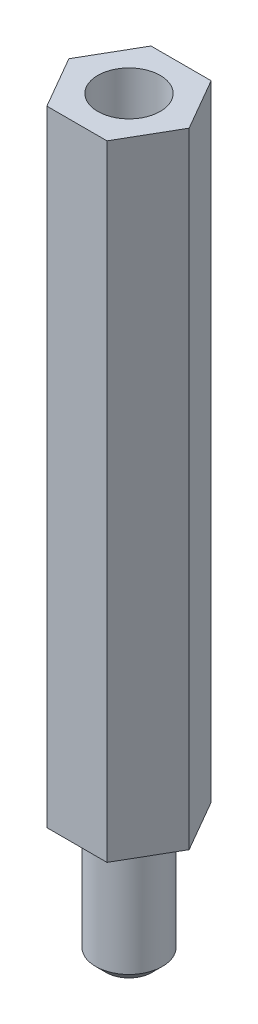
ISO-10303-21;
HEADER;
FILE_DESCRIPTION(('STEP AP214'),'2;1');
FILE_NAME('part.step','',(''),(''),'','','');
FILE_SCHEMA(('AUTOMOTIVE_DESIGN { 1 0 10303 214 1 1 1 1 }'));
ENDSEC;
DATA;
#1=APPLICATION_CONTEXT('core data for automotive mechanical design processes');
#2=APPLICATION_PROTOCOL_DEFINITION('international standard','automotive_design',2000,#1);
#3=PRODUCT_CONTEXT('',#1,'mechanical');
#4=PRODUCT('Part','Part','',(#3));
#5=PRODUCT_RELATED_PRODUCT_CATEGORY('part','',(#4));
#6=PRODUCT_DEFINITION_FORMATION('','',#4);
#7=PRODUCT_DEFINITION_CONTEXT('part definition',#1,'design');
#8=PRODUCT_DEFINITION('design','',#6,#7);
#9=PRODUCT_DEFINITION_SHAPE('','',#8);
#10=(LENGTH_UNIT() NAMED_UNIT(*) SI_UNIT(.MILLI.,.METRE.));
#11=(NAMED_UNIT(*) PLANE_ANGLE_UNIT() SI_UNIT($,.RADIAN.));
#12=(NAMED_UNIT(*) SI_UNIT($,.STERADIAN.) SOLID_ANGLE_UNIT());
#13=UNCERTAINTY_MEASURE_WITH_UNIT(LENGTH_MEASURE(1.E-05),#10,'distance_accuracy_value','');
#14=(GEOMETRIC_REPRESENTATION_CONTEXT(3) GLOBAL_UNCERTAINTY_ASSIGNED_CONTEXT((#13)) GLOBAL_UNIT_ASSIGNED_CONTEXT((#10,
#11,#12)) REPRESENTATION_CONTEXT('',''));
#15=CARTESIAN_POINT('',(0.,0.,0.));
#16=DIRECTION('',(0.,0.,1.));
#17=DIRECTION('',(1.,0.,0.));
#18=AXIS2_PLACEMENT_3D('',#15,#16,#17);
#19=CARTESIAN_POINT('',(0.,30.,0.));
#20=DIRECTION('',(0.,-1.,0.));
#21=DIRECTION('',(0.,0.,-1.));
#22=AXIS2_PLACEMENT_3D('',#19,#20,#21);
#23=CYLINDRICAL_SURFACE('',#22,1.5);
#24=CARTESIAN_POINT('',(0.,23.,0.));
#25=DIRECTION('',(0.,-1.,0.));
#26=DIRECTION('',(0.,0.,-1.));
#27=AXIS2_PLACEMENT_3D('',#24,#25,#26);
#28=CIRCLE('',#27,1.5);
#29=CARTESIAN_POINT('',(0.,23.,-1.5));
#30=VERTEX_POINT('',#29);
#31=EDGE_CURVE('E43',#30,#30,#28,.T.);
#32=ORIENTED_EDGE('',*,*,#31,.T.);
#33=EDGE_LOOP('',(#32));
#34=FACE_BOUND('',#33,.T.);
#35=CARTESIAN_POINT('',(0.,30.,0.));
#36=DIRECTION('',(0.,1.,0.));
#37=DIRECTION('',(0.,0.,1.));
#38=AXIS2_PLACEMENT_3D('',#35,#36,#37);
#39=CIRCLE('',#38,1.5);
#40=CARTESIAN_POINT('',(0.,30.,1.5));
#41=VERTEX_POINT('',#40);
#42=EDGE_CURVE('E125',#41,#41,#39,.T.);
#43=ORIENTED_EDGE('',*,*,#42,.T.);
#44=EDGE_LOOP('',(#43));
#45=FACE_BOUND('',#44,.T.);
#46=ADVANCED_FACE('F34',(#34,#45),#23,.F.);
#47=CARTESIAN_POINT('',(0.,30.,-5.));
#48=DIRECTION('',(0.,1.,0.));
#49=DIRECTION('',(0.,0.,1.));
#50=AXIS2_PLACEMENT_3D('',#47,#48,#49);
#51=PLANE('',#50);
#52=DIRECTION('',(-0.5,0.,-0.866025403784439));
#53=VECTOR('',#52,1.);
#54=CARTESIAN_POINT('',(1.44337567297406,30.,-2.5));
#55=LINE('',#54,#53);
#56=CARTESIAN_POINT('',(2.88675134594813,30.,0.));
#57=VERTEX_POINT('',#56);
#58=CARTESIAN_POINT('',(1.44337567297406,30.,-2.5));
#59=VERTEX_POINT('',#58);
#60=EDGE_CURVE('E132',#57,#59,#55,.T.);
#61=ORIENTED_EDGE('',*,*,#60,.T.);
#62=DIRECTION('',(-1.,0.,0.));
#63=VECTOR('',#62,1.);
#64=CARTESIAN_POINT('',(-1.44337567297406,30.,-2.5));
#65=LINE('',#64,#63);
#66=CARTESIAN_POINT('',(-1.44337567297406,30.,-2.5));
#67=VERTEX_POINT('',#66);
#68=EDGE_CURVE('E89',#59,#67,#65,.T.);
#69=ORIENTED_EDGE('',*,*,#68,.T.);
#70=DIRECTION('',(-0.5,0.,0.866025403784438));
#71=VECTOR('',#70,1.);
#72=CARTESIAN_POINT('',(-2.88675134594813,30.,0.));
#73=LINE('',#72,#71);
#74=CARTESIAN_POINT('',(-2.88675134594813,30.,0.));
#75=VERTEX_POINT('',#74);
#76=EDGE_CURVE('E103',#67,#75,#73,.T.);
#77=ORIENTED_EDGE('',*,*,#76,.T.);
#78=DIRECTION('',(0.5,0.,0.866025403784438));
#79=VECTOR('',#78,1.);
#80=CARTESIAN_POINT('',(-1.44337567297406,30.,2.5));
#81=LINE('',#80,#79);
#82=CARTESIAN_POINT('',(-1.44337567297406,30.,2.5));
#83=VERTEX_POINT('',#82);
#84=EDGE_CURVE('E96',#75,#83,#81,.T.);
#85=ORIENTED_EDGE('',*,*,#84,.T.);
#86=DIRECTION('',(1.,0.,0.));
#87=VECTOR('',#86,1.);
#88=CARTESIAN_POINT('',(1.44337567297406,30.,2.5));
#89=LINE('',#88,#87);
#90=CARTESIAN_POINT('',(1.44337567297406,30.,2.5));
#91=VERTEX_POINT('',#90);
#92=EDGE_CURVE('E101',#83,#91,#89,.T.);
#93=ORIENTED_EDGE('',*,*,#92,.T.);
#94=DIRECTION('',(0.5,0.,-0.866025403784439));
#95=VECTOR('',#94,1.);
#96=CARTESIAN_POINT('',(2.88675134594813,30.,0.));
#97=LINE('',#96,#95);
#98=EDGE_CURVE('E51',#91,#57,#97,.T.);
#99=ORIENTED_EDGE('',*,*,#98,.T.);
#100=EDGE_LOOP('',(#61,#69,#77,#85,#93,#99));
#101=FACE_BOUND('',#100,.T.);
#102=ORIENTED_EDGE('',*,*,#42,.F.);
#103=EDGE_LOOP('',(#102));
#104=FACE_BOUND('',#103,.T.);
#105=ADVANCED_FACE('F98',(#101,#104),#51,.T.);
#106=CARTESIAN_POINT('',(0.,0.,-5.));
#107=DIRECTION('',(0.,1.,0.));
#108=DIRECTION('',(0.,0.,1.));
#109=AXIS2_PLACEMENT_3D('',#106,#107,#108);
#110=PLANE('',#109);
#111=CARTESIAN_POINT('',(0.,0.,0.));
#112=DIRECTION('',(0.,1.,0.));
#113=DIRECTION('',(0.,0.,1.));
#114=AXIS2_PLACEMENT_3D('',#111,#112,#113);
#115=CIRCLE('',#114,2.1);
#116=CARTESIAN_POINT('',(0.,0.,2.1));
#117=VERTEX_POINT('',#116);
#118=EDGE_CURVE('E147',#117,#117,#115,.T.);
#119=ORIENTED_EDGE('',*,*,#118,.T.);
#120=EDGE_LOOP('',(#119));
#121=FACE_BOUND('',#120,.T.);
#122=DIRECTION('',(-0.5,0.,-0.866025403784439));
#123=VECTOR('',#122,1.);
#124=CARTESIAN_POINT('',(1.44337567297406,0.,-2.5));
#125=LINE('',#124,#123);
#126=CARTESIAN_POINT('',(2.88675134594813,0.,0.));
#127=VERTEX_POINT('',#126);
#128=CARTESIAN_POINT('',(1.44337567297406,0.,-2.5));
#129=VERTEX_POINT('',#128);
#130=EDGE_CURVE('E121',#127,#129,#125,.T.);
#131=ORIENTED_EDGE('',*,*,#130,.F.);
#132=DIRECTION('',(0.5,0.,-0.866025403784439));
#133=VECTOR('',#132,1.);
#134=CARTESIAN_POINT('',(2.88675134594813,0.,0.));
#135=LINE('',#134,#133);
#136=CARTESIAN_POINT('',(1.44337567297406,0.,2.5));
#137=VERTEX_POINT('',#136);
#138=EDGE_CURVE('E80',#137,#127,#135,.T.);
#139=ORIENTED_EDGE('',*,*,#138,.F.);
#140=DIRECTION('',(1.,0.,0.));
#141=VECTOR('',#140,1.);
#142=CARTESIAN_POINT('',(1.44337567297406,0.,2.5));
#143=LINE('',#142,#141);
#144=CARTESIAN_POINT('',(-1.44337567297406,0.,2.5));
#145=VERTEX_POINT('',#144);
#146=EDGE_CURVE('E74',#145,#137,#143,.T.);
#147=ORIENTED_EDGE('',*,*,#146,.F.);
#148=DIRECTION('',(0.5,0.,0.866025403784438));
#149=VECTOR('',#148,1.);
#150=CARTESIAN_POINT('',(-1.44337567297406,0.,2.5));
#151=LINE('',#150,#149);
#152=CARTESIAN_POINT('',(-2.88675134594813,0.,0.));
#153=VERTEX_POINT('',#152);
#154=EDGE_CURVE('E111',#153,#145,#151,.T.);
#155=ORIENTED_EDGE('',*,*,#154,.F.);
#156=DIRECTION('',(-0.5,0.,0.866025403784438));
#157=VECTOR('',#156,1.);
#158=CARTESIAN_POINT('',(-2.88675134594813,0.,0.));
#159=LINE('',#158,#157);
#160=CARTESIAN_POINT('',(-1.44337567297406,0.,-2.5));
#161=VERTEX_POINT('',#160);
#162=EDGE_CURVE('E127',#161,#153,#159,.T.);
#163=ORIENTED_EDGE('',*,*,#162,.F.);
#164=DIRECTION('',(-1.,0.,0.));
#165=VECTOR('',#164,1.);
#166=CARTESIAN_POINT('',(-1.44337567297406,0.,-2.5));
#167=LINE('',#166,#165);
#168=EDGE_CURVE('E124',#129,#161,#167,.T.);
#169=ORIENTED_EDGE('',*,*,#168,.F.);
#170=EDGE_LOOP('',(#131,#139,#147,#155,#163,#169));
#171=FACE_BOUND('',#170,.T.);
#172=ADVANCED_FACE('F171',(#121,#171),#110,.F.);
#173=CARTESIAN_POINT('',(1.44337567297406,30.,-2.5));
#174=DIRECTION('',(-0.866025403784439,0.,0.5));
#175=DIRECTION('',(0.5,0.,0.866025403784439));
#176=AXIS2_PLACEMENT_3D('',#173,#174,#175);
#177=PLANE('',#176);
#178=ORIENTED_EDGE('',*,*,#130,.T.);
#179=DIRECTION('',(0.,-1.,0.));
#180=VECTOR('',#179,1.);
#181=CARTESIAN_POINT('',(1.44337567297406,30.,-2.5));
#182=LINE('',#181,#180);
#183=EDGE_CURVE('E139',#59,#129,#182,.T.);
#184=ORIENTED_EDGE('',*,*,#183,.F.);
#185=ORIENTED_EDGE('',*,*,#60,.F.);
#186=DIRECTION('',(0.,-1.,0.));
#187=VECTOR('',#186,1.);
#188=CARTESIAN_POINT('',(2.88675134594813,30.,0.));
#189=LINE('',#188,#187);
#190=EDGE_CURVE('E117',#57,#127,#189,.T.);
#191=ORIENTED_EDGE('',*,*,#190,.T.);
#192=EDGE_LOOP('',(#178,#184,#185,#191));
#193=FACE_BOUND('',#192,.T.);
#194=ADVANCED_FACE('F179',(#193),#177,.F.);
#195=CARTESIAN_POINT('',(-1.44337567297406,30.,-2.5));
#196=DIRECTION('',(0.,0.,1.));
#197=DIRECTION('',(1.,0.,0.));
#198=AXIS2_PLACEMENT_3D('',#195,#196,#197);
#199=PLANE('',#198);
#200=ORIENTED_EDGE('',*,*,#168,.T.);
#201=DIRECTION('',(0.,-1.,0.));
#202=VECTOR('',#201,1.);
#203=CARTESIAN_POINT('',(-1.44337567297406,30.,-2.5));
#204=LINE('',#203,#202);
#205=EDGE_CURVE('E136',#67,#161,#204,.T.);
#206=ORIENTED_EDGE('',*,*,#205,.F.);
#207=ORIENTED_EDGE('',*,*,#68,.F.);
#208=ORIENTED_EDGE('',*,*,#183,.T.);
#209=EDGE_LOOP('',(#200,#206,#207,#208));
#210=FACE_BOUND('',#209,.T.);
#211=ADVANCED_FACE('F192',(#210),#199,.F.);
#212=CARTESIAN_POINT('',(-2.88675134594813,30.,0.));
#213=DIRECTION('',(0.866025403784438,0.,0.5));
#214=DIRECTION('',(0.5,0.,-0.866025403784439));
#215=AXIS2_PLACEMENT_3D('',#212,#213,#214);
#216=PLANE('',#215);
#217=ORIENTED_EDGE('',*,*,#162,.T.);
#218=DIRECTION('',(0.,-1.,0.));
#219=VECTOR('',#218,1.);
#220=CARTESIAN_POINT('',(-2.88675134594813,30.,0.));
#221=LINE('',#220,#219);
#222=EDGE_CURVE('E112',#75,#153,#221,.T.);
#223=ORIENTED_EDGE('',*,*,#222,.F.);
#224=ORIENTED_EDGE('',*,*,#76,.F.);
#225=ORIENTED_EDGE('',*,*,#205,.T.);
#226=EDGE_LOOP('',(#217,#223,#224,#225));
#227=FACE_BOUND('',#226,.T.);
#228=ADVANCED_FACE('F189',(#227),#216,.F.);
#229=CARTESIAN_POINT('',(-1.44337567297406,30.,2.5));
#230=DIRECTION('',(0.866025403784438,0.,-0.5));
#231=DIRECTION('',(-0.5,0.,-0.866025403784438));
#232=AXIS2_PLACEMENT_3D('',#229,#230,#231);
#233=PLANE('',#232);
#234=ORIENTED_EDGE('',*,*,#154,.T.);
#235=DIRECTION('',(0.,-1.,0.));
#236=VECTOR('',#235,1.);
#237=CARTESIAN_POINT('',(-1.44337567297406,30.,2.5));
#238=LINE('',#237,#236);
#239=EDGE_CURVE('E108',#83,#145,#238,.T.);
#240=ORIENTED_EDGE('',*,*,#239,.F.);
#241=ORIENTED_EDGE('',*,*,#84,.F.);
#242=ORIENTED_EDGE('',*,*,#222,.T.);
#243=EDGE_LOOP('',(#234,#240,#241,#242));
#244=FACE_BOUND('',#243,.T.);
#245=ADVANCED_FACE('F109',(#244),#233,.F.);
#246=CARTESIAN_POINT('',(1.44337567297406,30.,2.5));
#247=DIRECTION('',(0.,0.,-1.));
#248=DIRECTION('',(-1.,0.,0.));
#249=AXIS2_PLACEMENT_3D('',#246,#247,#248);
#250=PLANE('',#249);
#251=ORIENTED_EDGE('',*,*,#146,.T.);
#252=DIRECTION('',(0.,-1.,0.));
#253=VECTOR('',#252,1.);
#254=CARTESIAN_POINT('',(1.44337567297406,30.,2.5));
#255=LINE('',#254,#253);
#256=EDGE_CURVE('E113',#91,#137,#255,.T.);
#257=ORIENTED_EDGE('',*,*,#256,.F.);
#258=ORIENTED_EDGE('',*,*,#92,.F.);
#259=ORIENTED_EDGE('',*,*,#239,.T.);
#260=EDGE_LOOP('',(#251,#257,#258,#259));
#261=FACE_BOUND('',#260,.T.);
#262=ADVANCED_FACE('F115',(#261),#250,.F.);
#263=CARTESIAN_POINT('',(2.88675134594813,30.,0.));
#264=DIRECTION('',(-0.866025403784439,0.,-0.5));
#265=DIRECTION('',(-0.5,0.,0.866025403784439));
#266=AXIS2_PLACEMENT_3D('',#263,#264,#265);
#267=PLANE('',#266);
#268=ORIENTED_EDGE('',*,*,#138,.T.);
#269=ORIENTED_EDGE('',*,*,#190,.F.);
#270=ORIENTED_EDGE('',*,*,#98,.F.);
#271=ORIENTED_EDGE('',*,*,#256,.T.);
#272=EDGE_LOOP('',(#268,#269,#270,#271));
#273=FACE_BOUND('',#272,.T.);
#274=ADVANCED_FACE('F181',(#273),#267,.F.);
#275=CARTESIAN_POINT('',(0.,22.,0.));
#276=DIRECTION('',(0.,-1.,0.));
#277=DIRECTION('',(0.,0.,-1.));
#278=AXIS2_PLACEMENT_3D('',#275,#276,#277);
#279=PLANE('',#278);
#280=CARTESIAN_POINT('',(0.,22.,0.));
#281=DIRECTION('',(0.,-1.,0.));
#282=DIRECTION('',(0.,0.,-1.));
#283=AXIS2_PLACEMENT_3D('',#280,#281,#282);
#284=CIRCLE('',#283,0.5);
#285=CARTESIAN_POINT('',(0.,22.,-0.5));
#286=VERTEX_POINT('',#285);
#287=EDGE_CURVE('E11',#286,#286,#284,.F.);
#288=ORIENTED_EDGE('',*,*,#287,.T.);
#289=EDGE_LOOP('',(#288));
#290=FACE_BOUND('',#289,.T.);
#291=ADVANCED_FACE('F184',(#290),#279,.F.);
#292=CARTESIAN_POINT('',(0.,22.,0.));
#293=DIRECTION('',(0.,-1.,0.));
#294=DIRECTION('',(0.,0.,-1.));
#295=AXIS2_PLACEMENT_3D('',#292,#293,#294);
#296=CYLINDRICAL_SURFACE('',#295,1.6);
#297=CARTESIAN_POINT('',(0.,-0.5,0.));
#298=DIRECTION('',(0.,1.,0.));
#299=DIRECTION('',(0.,0.,1.));
#300=AXIS2_PLACEMENT_3D('',#297,#298,#299);
#301=CIRCLE('',#300,1.6);
#302=CARTESIAN_POINT('',(0.,-0.5,1.6));
#303=VERTEX_POINT('',#302);
#304=EDGE_CURVE('E150',#303,#303,#301,.F.);
#305=ORIENTED_EDGE('',*,*,#304,.T.);
#306=EDGE_LOOP('',(#305));
#307=FACE_BOUND('',#306,.T.);
#308=CARTESIAN_POINT('',(0.,-5.50000000000001,0.));
#309=DIRECTION('',(0.,-1.,0.));
#310=DIRECTION('',(0.,0.,-1.));
#311=AXIS2_PLACEMENT_3D('',#308,#309,#310);
#312=CIRCLE('',#311,1.6);
#313=CARTESIAN_POINT('',(0.,-5.50000000000001,-1.6));
#314=VERTEX_POINT('',#313);
#315=EDGE_CURVE('E144',#314,#314,#312,.F.);
#316=ORIENTED_EDGE('',*,*,#315,.T.);
#317=EDGE_LOOP('',(#316));
#318=FACE_BOUND('',#317,.T.);
#319=ADVANCED_FACE('F174',(#307,#318),#296,.T.);
#320=CARTESIAN_POINT('',(0.,-6.,0.));
#321=DIRECTION('',(0.,-1.,0.));
#322=DIRECTION('',(0.,0.,-1.));
#323=AXIS2_PLACEMENT_3D('',#320,#321,#322);
#324=PLANE('',#323);
#325=CARTESIAN_POINT('',(0.,-6.,0.));
#326=DIRECTION('',(0.,-1.,0.));
#327=DIRECTION('',(0.,0.,-1.));
#328=AXIS2_PLACEMENT_3D('',#325,#326,#327);
#329=CIRCLE('',#328,1.10000000000001);
#330=CARTESIAN_POINT('',(0.,-6.,-1.10000000000001));
#331=VERTEX_POINT('',#330);
#332=EDGE_CURVE('E141',#331,#331,#329,.T.);
#333=ORIENTED_EDGE('',*,*,#332,.T.);
#334=EDGE_LOOP('',(#333));
#335=FACE_BOUND('',#334,.T.);
#336=ADVANCED_FACE('F200',(#335),#324,.T.);
#337=CARTESIAN_POINT('',(0.,-6.,0.));
#338=DIRECTION('',(0.,1.,0.));
#339=DIRECTION('',(0.,0.,1.));
#340=AXIS2_PLACEMENT_3D('',#337,#338,#339);
#341=CONICAL_SURFACE('',#340,1.10000000000001,0.785398163397448);
#342=ORIENTED_EDGE('',*,*,#315,.F.);
#343=EDGE_LOOP('',(#342));
#344=FACE_BOUND('',#343,.T.);
#345=ORIENTED_EDGE('',*,*,#332,.F.);
#346=EDGE_LOOP('',(#345));
#347=FACE_BOUND('',#346,.T.);
#348=ADVANCED_FACE('F163',(#344,#347),#341,.T.);
#349=CARTESIAN_POINT('',(0.,-0.5,0.));
#350=DIRECTION('',(0.,1.,0.));
#351=DIRECTION('',(0.,0.,1.));
#352=AXIS2_PLACEMENT_3D('',#349,#350,#351);
#353=TOROIDAL_SURFACE('',#352,2.1,0.5);
#354=ORIENTED_EDGE('',*,*,#304,.F.);
#355=EDGE_LOOP('',(#354));
#356=FACE_BOUND('',#355,.T.);
#357=ORIENTED_EDGE('',*,*,#118,.F.);
#358=EDGE_LOOP('',(#357));
#359=FACE_BOUND('',#358,.T.);
#360=ADVANCED_FACE('F158',(#356,#359),#353,.F.);
#361=CARTESIAN_POINT('',(0.,23.,0.));
#362=DIRECTION('',(0.,-1.,0.));
#363=DIRECTION('',(0.,0.,-1.));
#364=AXIS2_PLACEMENT_3D('',#361,#362,#363);
#365=DEGENERATE_TOROIDAL_SURFACE('',#364,0.5,1.,.T.);
#366=ORIENTED_EDGE('',*,*,#287,.F.);
#367=EDGE_LOOP('',(#366));
#368=FACE_BOUND('',#367,.T.);
#369=ORIENTED_EDGE('',*,*,#31,.F.);
#370=EDGE_LOOP('',(#369));
#371=FACE_BOUND('',#370,.T.);
#372=ADVANCED_FACE('F36',(#368,#371),#365,.F.);
#373=CLOSED_SHELL('',(#46,#105,#172,#194,#211,#228,#245,#262,#274,#291,#319,#336,#348,#360,#372));
#374=MANIFOLD_SOLID_BREP('B2',#373);
#375=ADVANCED_BREP_SHAPE_REPRESENTATION('',(#18,#374),#14);
#376=SHAPE_DEFINITION_REPRESENTATION(#9,#375);
ENDSEC;
END-ISO-10303-21;
